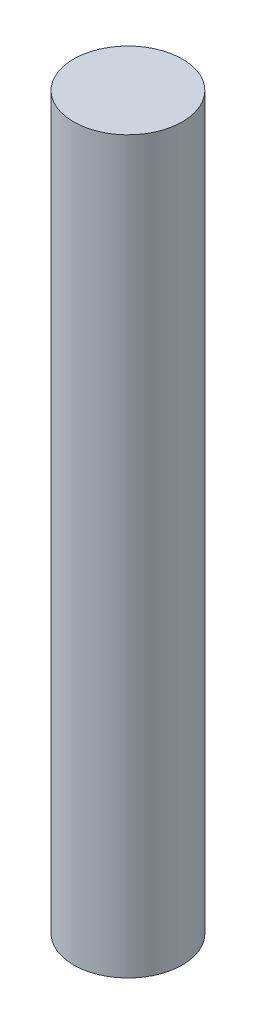
ISO-10303-21;
HEADER;
FILE_DESCRIPTION(('STEP AP214'),'2;1');
FILE_NAME('part.step','',(''),(''),'','','');
FILE_SCHEMA(('AUTOMOTIVE_DESIGN { 1 0 10303 214 1 1 1 1 }'));
ENDSEC;
DATA;
#1=APPLICATION_CONTEXT('core data for automotive mechanical design processes');
#2=APPLICATION_PROTOCOL_DEFINITION('international standard','automotive_design',2000,#1);
#3=PRODUCT_CONTEXT('',#1,'mechanical');
#4=PRODUCT('Part','Part','',(#3));
#5=PRODUCT_RELATED_PRODUCT_CATEGORY('part','',(#4));
#6=PRODUCT_DEFINITION_FORMATION('','',#4);
#7=PRODUCT_DEFINITION_CONTEXT('part definition',#1,'design');
#8=PRODUCT_DEFINITION('design','',#6,#7);
#9=PRODUCT_DEFINITION_SHAPE('','',#8);
#10=(LENGTH_UNIT() NAMED_UNIT(*) SI_UNIT(.MILLI.,.METRE.));
#11=(NAMED_UNIT(*) PLANE_ANGLE_UNIT() SI_UNIT($,.RADIAN.));
#12=(NAMED_UNIT(*) SI_UNIT($,.STERADIAN.) SOLID_ANGLE_UNIT());
#13=UNCERTAINTY_MEASURE_WITH_UNIT(LENGTH_MEASURE(1.E-05),#10,'distance_accuracy_value','');
#14=(GEOMETRIC_REPRESENTATION_CONTEXT(3) GLOBAL_UNCERTAINTY_ASSIGNED_CONTEXT((#13)) GLOBAL_UNIT_ASSIGNED_CONTEXT((#10,
#11,#12)) REPRESENTATION_CONTEXT('',''));
#15=CARTESIAN_POINT('',(0.,0.,0.));
#16=DIRECTION('',(0.,0.,1.));
#17=DIRECTION('',(1.,0.,0.));
#18=AXIS2_PLACEMENT_3D('',#15,#16,#17);
#19=CARTESIAN_POINT('',(0.,100.,0.));
#20=DIRECTION('',(0.,-1.,0.));
#21=DIRECTION('',(0.,0.,-1.));
#22=AXIS2_PLACEMENT_3D('',#19,#20,#21);
#23=CYLINDRICAL_SURFACE('',#22,7.45);
#24=CARTESIAN_POINT('',(0.,100.,0.));
#25=DIRECTION('',(0.,1.,0.));
#26=DIRECTION('',(0.,0.,1.));
#27=AXIS2_PLACEMENT_3D('',#24,#25,#26);
#28=CIRCLE('',#27,7.45);
#29=CARTESIAN_POINT('',(0.,100.,7.45));
#30=VERTEX_POINT('',#29);
#31=EDGE_CURVE('E10',#30,#30,#28,.T.);
#32=ORIENTED_EDGE('',*,*,#31,.F.);
#33=EDGE_LOOP('',(#32));
#34=FACE_BOUND('',#33,.T.);
#35=CARTESIAN_POINT('',(0.,0.,0.));
#36=DIRECTION('',(0.,1.,0.));
#37=DIRECTION('',(0.,0.,1.));
#38=AXIS2_PLACEMENT_3D('',#35,#36,#37);
#39=CIRCLE('',#38,7.45);
#40=CARTESIAN_POINT('',(0.,0.,7.45));
#41=VERTEX_POINT('',#40);
#42=EDGE_CURVE('E36',#41,#41,#39,.T.);
#43=ORIENTED_EDGE('',*,*,#42,.T.);
#44=EDGE_LOOP('',(#43));
#45=FACE_BOUND('',#44,.T.);
#46=ADVANCED_FACE('F33',(#34,#45),#23,.T.);
#47=CARTESIAN_POINT('',(0.,100.,0.));
#48=DIRECTION('',(0.,1.,0.));
#49=DIRECTION('',(0.,0.,1.));
#50=AXIS2_PLACEMENT_3D('',#47,#48,#49);
#51=PLANE('',#50);
#52=ORIENTED_EDGE('',*,*,#31,.T.);
#53=EDGE_LOOP('',(#52));
#54=FACE_BOUND('',#53,.T.);
#55=ADVANCED_FACE('F48',(#54),#51,.T.);
#56=CARTESIAN_POINT('',(0.,0.,0.));
#57=DIRECTION('',(0.,1.,0.));
#58=DIRECTION('',(0.,0.,1.));
#59=AXIS2_PLACEMENT_3D('',#56,#57,#58);
#60=PLANE('',#59);
#61=ORIENTED_EDGE('',*,*,#42,.F.);
#62=EDGE_LOOP('',(#61));
#63=FACE_BOUND('',#62,.T.);
#64=ADVANCED_FACE('F46',(#63),#60,.F.);
#65=CLOSED_SHELL('',(#46,#55,#64));
#66=MANIFOLD_SOLID_BREP('B2',#65);
#67=ADVANCED_BREP_SHAPE_REPRESENTATION('',(#18,#66),#14);
#68=SHAPE_DEFINITION_REPRESENTATION(#9,#67);
ENDSEC;
END-ISO-10303-21;
